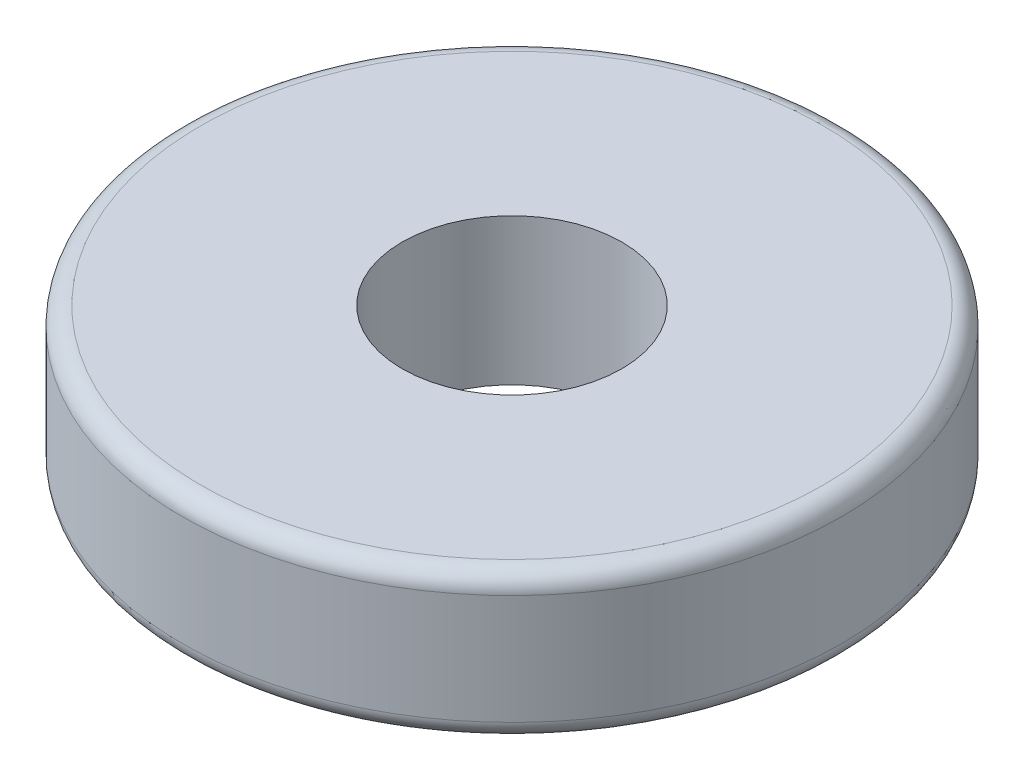
ISO-10303-21;
HEADER;
FILE_DESCRIPTION(('STEP AP214'),'2;1');
FILE_NAME('part.step','',(''),(''),'','','');
FILE_SCHEMA(('AUTOMOTIVE_DESIGN { 1 0 10303 214 1 1 1 1 }'));
ENDSEC;
DATA;
#1=APPLICATION_CONTEXT('core data for automotive mechanical design processes');
#2=APPLICATION_PROTOCOL_DEFINITION('international standard','automotive_design',2000,#1);
#3=PRODUCT_CONTEXT('',#1,'mechanical');
#4=PRODUCT('Part','Part','',(#3));
#5=PRODUCT_RELATED_PRODUCT_CATEGORY('part','',(#4));
#6=PRODUCT_DEFINITION_FORMATION('','',#4);
#7=PRODUCT_DEFINITION_CONTEXT('part definition',#1,'design');
#8=PRODUCT_DEFINITION('design','',#6,#7);
#9=PRODUCT_DEFINITION_SHAPE('','',#8);
#10=(LENGTH_UNIT() NAMED_UNIT(*) SI_UNIT(.MILLI.,.METRE.));
#11=(NAMED_UNIT(*) PLANE_ANGLE_UNIT() SI_UNIT($,.RADIAN.));
#12=(NAMED_UNIT(*) SI_UNIT($,.STERADIAN.) SOLID_ANGLE_UNIT());
#13=UNCERTAINTY_MEASURE_WITH_UNIT(LENGTH_MEASURE(1.E-05),#10,'distance_accuracy_value','');
#14=(GEOMETRIC_REPRESENTATION_CONTEXT(3) GLOBAL_UNCERTAINTY_ASSIGNED_CONTEXT((#13)) GLOBAL_UNIT_ASSIGNED_CONTEXT((#10,
#11,#12)) REPRESENTATION_CONTEXT('',''));
#15=CARTESIAN_POINT('',(0.,0.,0.));
#16=DIRECTION('',(0.,0.,1.));
#17=DIRECTION('',(1.,0.,0.));
#18=AXIS2_PLACEMENT_3D('',#15,#16,#17);
#19=CARTESIAN_POINT('',(21.25,5.00000000000002,0.));
#20=DIRECTION('',(0.,1.,0.));
#21=DIRECTION('',(-1.,0.,0.));
#22=AXIS2_PLACEMENT_3D('',#19,#20,#21);
#23=PLANE('',#22);
#24=CARTESIAN_POINT('',(0.,5.,0.));
#25=DIRECTION('',(0.,-1.,0.));
#26=DIRECTION('',(1.,0.,0.));
#27=AXIS2_PLACEMENT_3D('',#24,#25,#26);
#28=CIRCLE('',#27,7.50000000000002);
#29=CARTESIAN_POINT('',(7.5,5.00000000000003,0.));
#30=VERTEX_POINT('',#29);
#31=EDGE_CURVE('E10',#30,#30,#28,.T.);
#32=ORIENTED_EDGE('',*,*,#31,.T.);
#33=EDGE_LOOP('',(#32));
#34=FACE_BOUND('',#33,.T.);
#35=CARTESIAN_POINT('',(0.,4.99999999999995,0.));
#36=DIRECTION('',(0.,-1.,0.));
#37=DIRECTION('',(1.,0.,0.));
#38=AXIS2_PLACEMENT_3D('',#35,#36,#37);
#39=CIRCLE('',#38,21.25);
#40=CARTESIAN_POINT('',(21.25,5.00000000000002,0.));
#41=VERTEX_POINT('',#40);
#42=EDGE_CURVE('E57',#41,#41,#39,.T.);
#43=ORIENTED_EDGE('',*,*,#42,.F.);
#44=EDGE_LOOP('',(#43));
#45=FACE_BOUND('',#44,.T.);
#46=ADVANCED_FACE('F34',(#34,#45),#23,.T.);
#47=CARTESIAN_POINT('',(1.18829503014473E-12,-346.416551839449,0.));
#48=DIRECTION('',(0.,-1.,0.));
#49=DIRECTION('',(1.,0.,0.));
#50=AXIS2_PLACEMENT_3D('',#47,#48,#49);
#51=CYLINDRICAL_SURFACE('',#50,7.5);
#52=CARTESIAN_POINT('',(0.,-5.,0.));
#53=DIRECTION('',(0.,-1.,0.));
#54=DIRECTION('',(1.,0.,0.));
#55=AXIS2_PLACEMENT_3D('',#52,#53,#54);
#56=CIRCLE('',#55,7.49999999999998);
#57=CARTESIAN_POINT('',(7.5,-4.99999999999998,0.));
#58=VERTEX_POINT('',#57);
#59=EDGE_CURVE('E41',#58,#58,#56,.T.);
#60=ORIENTED_EDGE('',*,*,#59,.T.);
#61=EDGE_LOOP('',(#60));
#62=FACE_BOUND('',#61,.T.);
#63=ORIENTED_EDGE('',*,*,#31,.F.);
#64=EDGE_LOOP('',(#63));
#65=FACE_BOUND('',#64,.T.);
#66=ADVANCED_FACE('F113',(#62,#65),#51,.F.);
#67=CARTESIAN_POINT('',(7.5,-5.00000000000002,0.));
#68=DIRECTION('',(0.,-1.,0.));
#69=DIRECTION('',(1.,0.,0.));
#70=AXIS2_PLACEMENT_3D('',#67,#68,#69);
#71=PLANE('',#70);
#72=CARTESIAN_POINT('',(0.,-5.00000000000006,0.));
#73=DIRECTION('',(0.,-1.,0.));
#74=DIRECTION('',(1.,0.,0.));
#75=AXIS2_PLACEMENT_3D('',#72,#73,#74);
#76=CIRCLE('',#75,21.25);
#77=CARTESIAN_POINT('',(21.25,-4.99999999999999,0.));
#78=VERTEX_POINT('',#77);
#79=EDGE_CURVE('E45',#78,#78,#76,.T.);
#80=ORIENTED_EDGE('',*,*,#79,.T.);
#81=EDGE_LOOP('',(#80));
#82=FACE_BOUND('',#81,.T.);
#83=ORIENTED_EDGE('',*,*,#59,.F.);
#84=EDGE_LOOP('',(#83));
#85=FACE_BOUND('',#84,.T.);
#86=ADVANCED_FACE('F110',(#82,#85),#71,.T.);
#87=CARTESIAN_POINT('',(0.,-3.75000000000006,0.));
#88=DIRECTION('',(0.,-1.,0.));
#89=DIRECTION('',(1.,0.,0.));
#90=AXIS2_PLACEMENT_3D('',#87,#88,#89);
#91=TOROIDAL_SURFACE('',#90,21.25,1.25);
#92=CARTESIAN_POINT('',(0.,-3.75000000000003,0.));
#93=DIRECTION('',(0.,-1.,0.));
#94=DIRECTION('',(1.,0.,0.));
#95=AXIS2_PLACEMENT_3D('',#92,#93,#94);
#96=CIRCLE('',#95,22.5);
#97=CARTESIAN_POINT('',(22.5,-3.74999999999995,0.));
#98=VERTEX_POINT('',#97);
#99=EDGE_CURVE('E49',#98,#98,#96,.T.);
#100=ORIENTED_EDGE('',*,*,#99,.T.);
#101=EDGE_LOOP('',(#100));
#102=FACE_BOUND('',#101,.T.);
#103=ORIENTED_EDGE('',*,*,#79,.F.);
#104=EDGE_LOOP('',(#103));
#105=FACE_BOUND('',#104,.T.);
#106=ADVANCED_FACE('F106',(#102,#105),#91,.T.);
#107=CARTESIAN_POINT('',(1.18829503014473E-12,-346.416551839449,0.));
#108=DIRECTION('',(0.,-1.,0.));
#109=DIRECTION('',(1.,0.,0.));
#110=AXIS2_PLACEMENT_3D('',#107,#108,#109);
#111=CYLINDRICAL_SURFACE('',#110,22.5);
#112=CARTESIAN_POINT('',(0.,3.74999999999992,0.));
#113=DIRECTION('',(0.,-1.,0.));
#114=DIRECTION('',(1.,0.,0.));
#115=AXIS2_PLACEMENT_3D('',#112,#113,#114);
#116=CIRCLE('',#115,22.5);
#117=CARTESIAN_POINT('',(22.5,3.75,0.));
#118=VERTEX_POINT('',#117);
#119=EDGE_CURVE('E54',#118,#118,#116,.T.);
#120=ORIENTED_EDGE('',*,*,#119,.T.);
#121=EDGE_LOOP('',(#120));
#122=FACE_BOUND('',#121,.T.);
#123=ORIENTED_EDGE('',*,*,#99,.F.);
#124=EDGE_LOOP('',(#123));
#125=FACE_BOUND('',#124,.T.);
#126=ADVANCED_FACE('F102',(#122,#125),#111,.T.);
#127=CARTESIAN_POINT('',(0.,3.74999999999994,0.));
#128=DIRECTION('',(0.,-1.,0.));
#129=DIRECTION('',(1.,0.,0.));
#130=AXIS2_PLACEMENT_3D('',#127,#128,#129);
#131=TOROIDAL_SURFACE('',#130,21.25,1.25000000000001);
#132=ORIENTED_EDGE('',*,*,#42,.T.);
#133=EDGE_LOOP('',(#132));
#134=FACE_BOUND('',#133,.T.);
#135=ORIENTED_EDGE('',*,*,#119,.F.);
#136=EDGE_LOOP('',(#135));
#137=FACE_BOUND('',#136,.T.);
#138=ADVANCED_FACE('F99',(#134,#137),#131,.T.);
#139=CLOSED_SHELL('',(#46,#66,#86,#106,#126,#138));
#140=CARTESIAN_POINT('',(1.18829503014473E-12,-346.416551839449,0.));
#141=DIRECTION('',(0.,-1.,0.));
#142=DIRECTION('',(1.,0.,0.));
#143=AXIS2_PLACEMENT_3D('',#140,#141,#142);
#144=CYLINDRICAL_SURFACE('',#143,21.);
#145=CARTESIAN_POINT('',(0.,3.49999999999995,0.));
#146=DIRECTION('',(0.,-1.,0.));
#147=DIRECTION('',(1.,0.,0.));
#148=AXIS2_PLACEMENT_3D('',#145,#146,#147);
#149=CIRCLE('',#148,21.);
#150=CARTESIAN_POINT('',(21.,3.50000000000002,0.));
#151=VERTEX_POINT('',#150);
#152=EDGE_CURVE('E69',#151,#151,#149,.T.);
#153=ORIENTED_EDGE('',*,*,#152,.F.);
#154=EDGE_LOOP('',(#153));
#155=FACE_BOUND('',#154,.T.);
#156=CARTESIAN_POINT('',(0.,-3.50000000000006,0.));
#157=DIRECTION('',(0.,-1.,0.));
#158=DIRECTION('',(1.,0.,0.));
#159=AXIS2_PLACEMENT_3D('',#156,#157,#158);
#160=CIRCLE('',#159,21.);
#161=CARTESIAN_POINT('',(21.,-3.49999999999999,0.));
#162=VERTEX_POINT('',#161);
#163=EDGE_CURVE('E60',#162,#162,#160,.T.);
#164=ORIENTED_EDGE('',*,*,#163,.T.);
#165=EDGE_LOOP('',(#164));
#166=FACE_BOUND('',#165,.T.);
#167=ADVANCED_FACE('F75',(#155,#166),#144,.F.);
#168=CARTESIAN_POINT('',(9.,-3.50000000000002,0.));
#169=DIRECTION('',(0.,-1.,0.));
#170=DIRECTION('',(1.,0.,0.));
#171=AXIS2_PLACEMENT_3D('',#168,#169,#170);
#172=PLANE('',#171);
#173=ORIENTED_EDGE('',*,*,#163,.F.);
#174=EDGE_LOOP('',(#173));
#175=FACE_BOUND('',#174,.T.);
#176=CARTESIAN_POINT('',(0.,-3.50000000000006,0.));
#177=DIRECTION('',(0.,-1.,0.));
#178=DIRECTION('',(1.,0.,0.));
#179=AXIS2_PLACEMENT_3D('',#176,#177,#178);
#180=CIRCLE('',#179,8.99999999999999);
#181=CARTESIAN_POINT('',(9.,-3.50000000000003,0.));
#182=VERTEX_POINT('',#181);
#183=EDGE_CURVE('E63',#182,#182,#180,.T.);
#184=ORIENTED_EDGE('',*,*,#183,.T.);
#185=EDGE_LOOP('',(#184));
#186=FACE_BOUND('',#185,.T.);
#187=ADVANCED_FACE('F78',(#175,#186),#172,.F.);
#188=CARTESIAN_POINT('',(1.18829503014473E-12,-346.416551839449,0.));
#189=DIRECTION('',(0.,-1.,0.));
#190=DIRECTION('',(1.,0.,0.));
#191=AXIS2_PLACEMENT_3D('',#188,#189,#190);
#192=CYLINDRICAL_SURFACE('',#191,9.);
#193=ORIENTED_EDGE('',*,*,#183,.F.);
#194=EDGE_LOOP('',(#193));
#195=FACE_BOUND('',#194,.T.);
#196=CARTESIAN_POINT('',(0.,3.49999999999995,0.));
#197=DIRECTION('',(0.,-1.,0.));
#198=DIRECTION('',(1.,0.,0.));
#199=AXIS2_PLACEMENT_3D('',#196,#197,#198);
#200=CIRCLE('',#199,9.00000000000001);
#201=CARTESIAN_POINT('',(9.,3.49999999999998,0.));
#202=VERTEX_POINT('',#201);
#203=EDGE_CURVE('E66',#202,#202,#200,.T.);
#204=ORIENTED_EDGE('',*,*,#203,.T.);
#205=EDGE_LOOP('',(#204));
#206=FACE_BOUND('',#205,.T.);
#207=ADVANCED_FACE('F85',(#195,#206),#192,.T.);
#208=CARTESIAN_POINT('',(21.,3.50000000000002,0.));
#209=DIRECTION('',(0.,1.,0.));
#210=DIRECTION('',(-1.,0.,0.));
#211=AXIS2_PLACEMENT_3D('',#208,#209,#210);
#212=PLANE('',#211);
#213=ORIENTED_EDGE('',*,*,#203,.F.);
#214=EDGE_LOOP('',(#213));
#215=FACE_BOUND('',#214,.T.);
#216=ORIENTED_EDGE('',*,*,#152,.T.);
#217=EDGE_LOOP('',(#216));
#218=FACE_BOUND('',#217,.T.);
#219=ADVANCED_FACE('F73',(#215,#218),#212,.F.);
#220=CLOSED_SHELL('',(#167,#187,#207,#219));
#221=ORIENTED_CLOSED_SHELL('',*,#220,.T.);
#222=BREP_WITH_VOIDS('B2',#139,(#221));
#223=ADVANCED_BREP_SHAPE_REPRESENTATION('',(#18,#222),#14);
#224=SHAPE_DEFINITION_REPRESENTATION(#9,#223);
ENDSEC;
END-ISO-10303-21;
